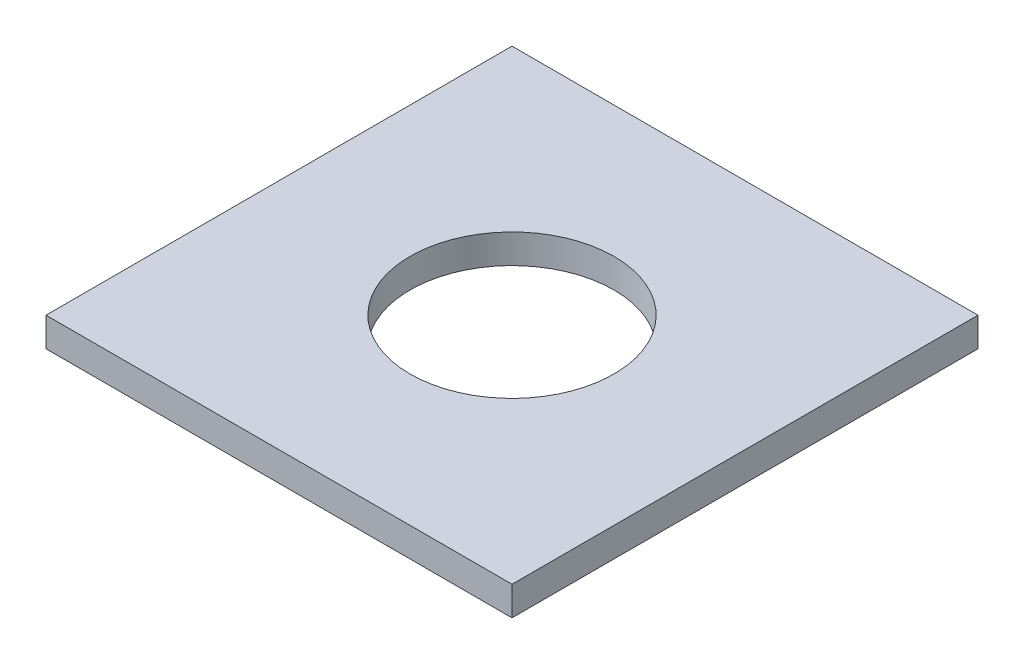
ISO-10303-21;
HEADER;
FILE_DESCRIPTION(('STEP AP214'),'2;1');
FILE_NAME('part.step','',(''),(''),'','','');
FILE_SCHEMA(('AUTOMOTIVE_DESIGN { 1 0 10303 214 1 1 1 1 }'));
ENDSEC;
DATA;
#1=APPLICATION_CONTEXT('core data for automotive mechanical design processes');
#2=APPLICATION_PROTOCOL_DEFINITION('international standard','automotive_design',2000,#1);
#3=PRODUCT_CONTEXT('',#1,'mechanical');
#4=PRODUCT('Part','Part','',(#3));
#5=PRODUCT_RELATED_PRODUCT_CATEGORY('part','',(#4));
#6=PRODUCT_DEFINITION_FORMATION('','',#4);
#7=PRODUCT_DEFINITION_CONTEXT('part definition',#1,'design');
#8=PRODUCT_DEFINITION('design','',#6,#7);
#9=PRODUCT_DEFINITION_SHAPE('','',#8);
#10=(LENGTH_UNIT() NAMED_UNIT(*) SI_UNIT(.MILLI.,.METRE.));
#11=(NAMED_UNIT(*) PLANE_ANGLE_UNIT() SI_UNIT($,.RADIAN.));
#12=(NAMED_UNIT(*) SI_UNIT($,.STERADIAN.) SOLID_ANGLE_UNIT());
#13=UNCERTAINTY_MEASURE_WITH_UNIT(LENGTH_MEASURE(1.E-05),#10,'distance_accuracy_value','');
#14=(GEOMETRIC_REPRESENTATION_CONTEXT(3) GLOBAL_UNCERTAINTY_ASSIGNED_CONTEXT((#13)) GLOBAL_UNIT_ASSIGNED_CONTEXT((#10,
#11,#12)) REPRESENTATION_CONTEXT('',''));
#15=CARTESIAN_POINT('',(0.,0.,0.));
#16=DIRECTION('',(0.,0.,1.));
#17=DIRECTION('',(1.,0.,0.));
#18=AXIS2_PLACEMENT_3D('',#15,#16,#17);
#19=CARTESIAN_POINT('',(0.,6.35,0.));
#20=DIRECTION('',(0.,-1.,0.));
#21=DIRECTION('',(0.,0.,-1.));
#22=AXIS2_PLACEMENT_3D('',#19,#20,#21);
#23=PLANE('',#22);
#24=DIRECTION('',(0.,0.,1.));
#25=VECTOR('',#24,1.);
#26=CARTESIAN_POINT('',(0.,6.35,0.));
#27=LINE('',#26,#25);
#28=CARTESIAN_POINT('',(0.,6.35,-101.6));
#29=VERTEX_POINT('',#28);
#30=CARTESIAN_POINT('',(0.,6.35,0.));
#31=VERTEX_POINT('',#30);
#32=EDGE_CURVE('E85',#29,#31,#27,.T.);
#33=ORIENTED_EDGE('',*,*,#32,.T.);
#34=DIRECTION('',(1.,0.,0.));
#35=VECTOR('',#34,1.);
#36=CARTESIAN_POINT('',(0.,6.35,0.));
#37=LINE('',#36,#35);
#38=CARTESIAN_POINT('',(101.6,6.35,0.));
#39=VERTEX_POINT('',#38);
#40=EDGE_CURVE('E80',#31,#39,#37,.T.);
#41=ORIENTED_EDGE('',*,*,#40,.T.);
#42=DIRECTION('',(0.,0.,-1.));
#43=VECTOR('',#42,1.);
#44=CARTESIAN_POINT('',(101.6,6.35,0.));
#45=LINE('',#44,#43);
#46=CARTESIAN_POINT('',(101.6,6.35,-101.6));
#47=VERTEX_POINT('',#46);
#48=EDGE_CURVE('E83',#39,#47,#45,.T.);
#49=ORIENTED_EDGE('',*,*,#48,.T.);
#50=DIRECTION('',(-1.,0.,0.));
#51=VECTOR('',#50,1.);
#52=CARTESIAN_POINT('',(0.,6.35,-101.6));
#53=LINE('',#52,#51);
#54=EDGE_CURVE('E50',#47,#29,#53,.T.);
#55=ORIENTED_EDGE('',*,*,#54,.T.);
#56=EDGE_LOOP('',(#33,#41,#49,#55));
#57=FACE_BOUND('',#56,.T.);
#58=CARTESIAN_POINT('',(50.8,6.35,-50.8));
#59=DIRECTION('',(0.,1.,0.));
#60=DIRECTION('',(0.,0.,1.));
#61=AXIS2_PLACEMENT_3D('',#58,#59,#60);
#62=CIRCLE('',#61,22.225);
#63=CARTESIAN_POINT('',(50.8,6.35,-28.575));
#64=VERTEX_POINT('',#63);
#65=EDGE_CURVE('E100',#64,#64,#62,.T.);
#66=ORIENTED_EDGE('',*,*,#65,.F.);
#67=EDGE_LOOP('',(#66));
#68=FACE_BOUND('',#67,.T.);
#69=ADVANCED_FACE('F33',(#57,#68),#23,.F.);
#70=CARTESIAN_POINT('',(0.,0.,0.));
#71=DIRECTION('',(0.,-1.,0.));
#72=DIRECTION('',(0.,0.,-1.));
#73=AXIS2_PLACEMENT_3D('',#70,#71,#72);
#74=PLANE('',#73);
#75=DIRECTION('',(0.,0.,1.));
#76=VECTOR('',#75,1.);
#77=CARTESIAN_POINT('',(0.,0.,0.));
#78=LINE('',#77,#76);
#79=CARTESIAN_POINT('',(0.,0.,-101.6));
#80=VERTEX_POINT('',#79);
#81=CARTESIAN_POINT('',(0.,0.,0.));
#82=VERTEX_POINT('',#81);
#83=EDGE_CURVE('E97',#80,#82,#78,.T.);
#84=ORIENTED_EDGE('',*,*,#83,.F.);
#85=DIRECTION('',(-1.,0.,0.));
#86=VECTOR('',#85,1.);
#87=CARTESIAN_POINT('',(0.,0.,-101.6));
#88=LINE('',#87,#86);
#89=CARTESIAN_POINT('',(101.6,0.,-101.6));
#90=VERTEX_POINT('',#89);
#91=EDGE_CURVE('E73',#90,#80,#88,.T.);
#92=ORIENTED_EDGE('',*,*,#91,.F.);
#93=DIRECTION('',(0.,0.,-1.));
#94=VECTOR('',#93,1.);
#95=CARTESIAN_POINT('',(101.6,0.,0.));
#96=LINE('',#95,#94);
#97=CARTESIAN_POINT('',(101.6,0.,0.));
#98=VERTEX_POINT('',#97);
#99=EDGE_CURVE('E67',#98,#90,#96,.T.);
#100=ORIENTED_EDGE('',*,*,#99,.F.);
#101=DIRECTION('',(1.,0.,0.));
#102=VECTOR('',#101,1.);
#103=CARTESIAN_POINT('',(0.,0.,0.));
#104=LINE('',#103,#102);
#105=EDGE_CURVE('E89',#82,#98,#104,.T.);
#106=ORIENTED_EDGE('',*,*,#105,.F.);
#107=EDGE_LOOP('',(#84,#92,#100,#106));
#108=FACE_BOUND('',#107,.T.);
#109=CARTESIAN_POINT('',(50.8,0.,-50.8));
#110=DIRECTION('',(0.,1.,0.));
#111=DIRECTION('',(0.,0.,1.));
#112=AXIS2_PLACEMENT_3D('',#109,#110,#111);
#113=CIRCLE('',#112,22.225);
#114=CARTESIAN_POINT('',(50.8,0.,-28.575));
#115=VERTEX_POINT('',#114);
#116=EDGE_CURVE('E112',#115,#115,#113,.T.);
#117=ORIENTED_EDGE('',*,*,#116,.T.);
#118=EDGE_LOOP('',(#117));
#119=FACE_BOUND('',#118,.T.);
#120=ADVANCED_FACE('F108',(#108,#119),#74,.T.);
#121=CARTESIAN_POINT('',(0.,6.35,0.));
#122=DIRECTION('',(1.,0.,0.));
#123=DIRECTION('',(0.,0.,-1.));
#124=AXIS2_PLACEMENT_3D('',#121,#122,#123);
#125=PLANE('',#124);
#126=ORIENTED_EDGE('',*,*,#83,.T.);
#127=DIRECTION('',(0.,-1.,0.));
#128=VECTOR('',#127,1.);
#129=CARTESIAN_POINT('',(0.,6.35,0.));
#130=LINE('',#129,#128);
#131=EDGE_CURVE('E11',#31,#82,#130,.T.);
#132=ORIENTED_EDGE('',*,*,#131,.F.);
#133=ORIENTED_EDGE('',*,*,#32,.F.);
#134=DIRECTION('',(0.,-1.,0.));
#135=VECTOR('',#134,1.);
#136=CARTESIAN_POINT('',(0.,6.35,-101.6));
#137=LINE('',#136,#135);
#138=EDGE_CURVE('E93',#29,#80,#137,.T.);
#139=ORIENTED_EDGE('',*,*,#138,.T.);
#140=EDGE_LOOP('',(#126,#132,#133,#139));
#141=FACE_BOUND('',#140,.T.);
#142=ADVANCED_FACE('F35',(#141),#125,.F.);
#143=CARTESIAN_POINT('',(0.,6.35,0.));
#144=DIRECTION('',(0.,0.,-1.));
#145=DIRECTION('',(-1.,0.,0.));
#146=AXIS2_PLACEMENT_3D('',#143,#144,#145);
#147=PLANE('',#146);
#148=ORIENTED_EDGE('',*,*,#105,.T.);
#149=DIRECTION('',(0.,-1.,0.));
#150=VECTOR('',#149,1.);
#151=CARTESIAN_POINT('',(101.6,6.35,0.));
#152=LINE('',#151,#150);
#153=EDGE_CURVE('E42',#39,#98,#152,.T.);
#154=ORIENTED_EDGE('',*,*,#153,.F.);
#155=ORIENTED_EDGE('',*,*,#40,.F.);
#156=ORIENTED_EDGE('',*,*,#131,.T.);
#157=EDGE_LOOP('',(#148,#154,#155,#156));
#158=FACE_BOUND('',#157,.T.);
#159=ADVANCED_FACE('F88',(#158),#147,.F.);
#160=CARTESIAN_POINT('',(101.6,6.35,0.));
#161=DIRECTION('',(-1.,0.,0.));
#162=DIRECTION('',(0.,0.,1.));
#163=AXIS2_PLACEMENT_3D('',#160,#161,#162);
#164=PLANE('',#163);
#165=ORIENTED_EDGE('',*,*,#99,.T.);
#166=DIRECTION('',(0.,-1.,0.));
#167=VECTOR('',#166,1.);
#168=CARTESIAN_POINT('',(101.6,6.35,-101.6));
#169=LINE('',#168,#167);
#170=EDGE_CURVE('E90',#47,#90,#169,.T.);
#171=ORIENTED_EDGE('',*,*,#170,.F.);
#172=ORIENTED_EDGE('',*,*,#48,.F.);
#173=ORIENTED_EDGE('',*,*,#153,.T.);
#174=EDGE_LOOP('',(#165,#171,#172,#173));
#175=FACE_BOUND('',#174,.T.);
#176=ADVANCED_FACE('F91',(#175),#164,.F.);
#177=CARTESIAN_POINT('',(0.,6.35,-101.6));
#178=DIRECTION('',(0.,0.,1.));
#179=DIRECTION('',(1.,0.,0.));
#180=AXIS2_PLACEMENT_3D('',#177,#178,#179);
#181=PLANE('',#180);
#182=ORIENTED_EDGE('',*,*,#91,.T.);
#183=ORIENTED_EDGE('',*,*,#138,.F.);
#184=ORIENTED_EDGE('',*,*,#54,.F.);
#185=ORIENTED_EDGE('',*,*,#170,.T.);
#186=EDGE_LOOP('',(#182,#183,#184,#185));
#187=FACE_BOUND('',#186,.T.);
#188=ADVANCED_FACE('F105',(#187),#181,.F.);
#189=CARTESIAN_POINT('',(50.8,6.35,-50.8));
#190=DIRECTION('',(0.,-1.,0.));
#191=DIRECTION('',(0.,0.,-1.));
#192=AXIS2_PLACEMENT_3D('',#189,#190,#191);
#193=CYLINDRICAL_SURFACE('',#192,22.225);
#194=ORIENTED_EDGE('',*,*,#65,.T.);
#195=EDGE_LOOP('',(#194));
#196=FACE_BOUND('',#195,.T.);
#197=ORIENTED_EDGE('',*,*,#116,.F.);
#198=EDGE_LOOP('',(#197));
#199=FACE_BOUND('',#198,.T.);
#200=ADVANCED_FACE('F118',(#196,#199),#193,.F.);
#201=CLOSED_SHELL('',(#69,#120,#142,#159,#176,#188,#200));
#202=MANIFOLD_SOLID_BREP('B2',#201);
#203=ADVANCED_BREP_SHAPE_REPRESENTATION('',(#18,#202),#14);
#204=SHAPE_DEFINITION_REPRESENTATION(#9,#203);
ENDSEC;
END-ISO-10303-21;
